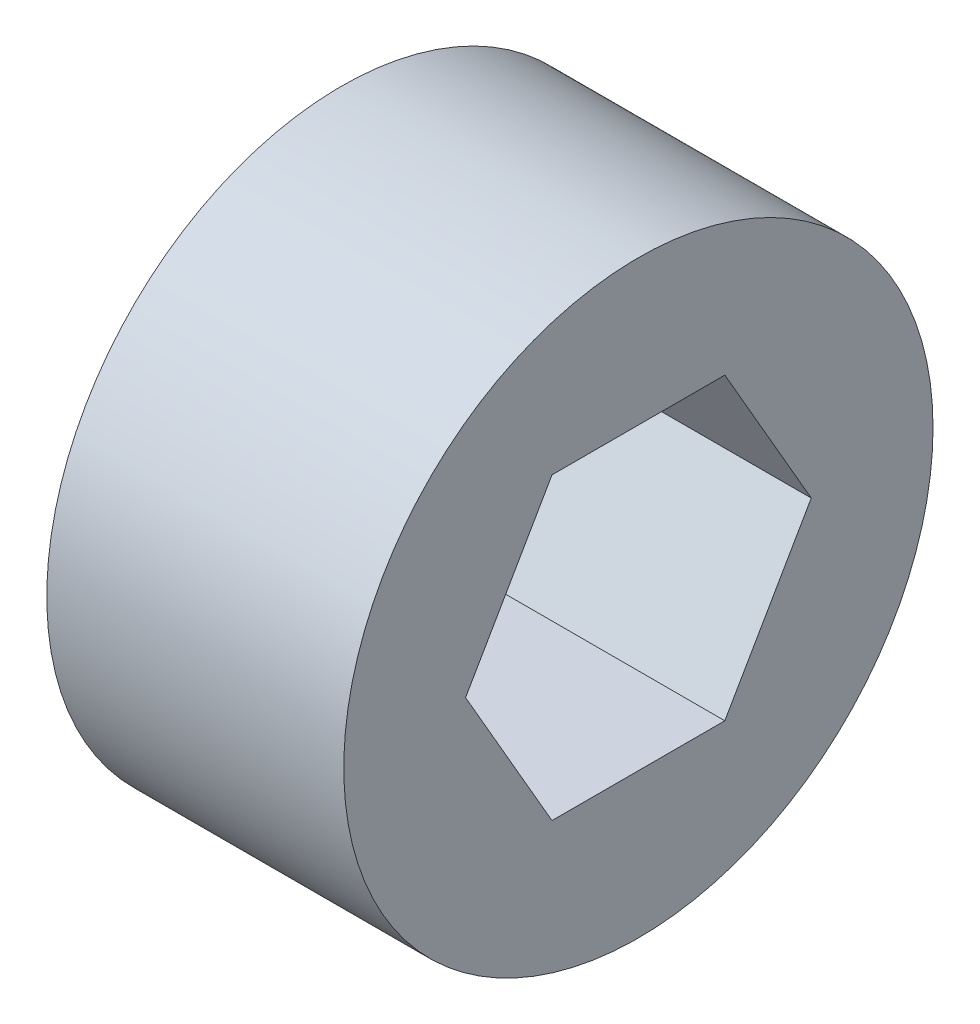
ISO-10303-21;
HEADER;
FILE_DESCRIPTION(('STEP AP214'),'2;1');
FILE_NAME('part.step','',(''),(''),'','','');
FILE_SCHEMA(('AUTOMOTIVE_DESIGN { 1 0 10303 214 1 1 1 1 }'));
ENDSEC;
DATA;
#1=APPLICATION_CONTEXT('core data for automotive mechanical design processes');
#2=APPLICATION_PROTOCOL_DEFINITION('international standard','automotive_design',2000,#1);
#3=PRODUCT_CONTEXT('',#1,'mechanical');
#4=PRODUCT('Part','Part','',(#3));
#5=PRODUCT_RELATED_PRODUCT_CATEGORY('part','',(#4));
#6=PRODUCT_DEFINITION_FORMATION('','',#4);
#7=PRODUCT_DEFINITION_CONTEXT('part definition',#1,'design');
#8=PRODUCT_DEFINITION('design','',#6,#7);
#9=PRODUCT_DEFINITION_SHAPE('','',#8);
#10=(LENGTH_UNIT() NAMED_UNIT(*) SI_UNIT(.MILLI.,.METRE.));
#11=(NAMED_UNIT(*) PLANE_ANGLE_UNIT() SI_UNIT($,.RADIAN.));
#12=(NAMED_UNIT(*) SI_UNIT($,.STERADIAN.) SOLID_ANGLE_UNIT());
#13=UNCERTAINTY_MEASURE_WITH_UNIT(LENGTH_MEASURE(1.E-05),#10,'distance_accuracy_value','');
#14=(GEOMETRIC_REPRESENTATION_CONTEXT(3) GLOBAL_UNCERTAINTY_ASSIGNED_CONTEXT((#13)) GLOBAL_UNIT_ASSIGNED_CONTEXT((#10,
#11,#12)) REPRESENTATION_CONTEXT('',''));
#15=CARTESIAN_POINT('',(0.,0.,0.));
#16=DIRECTION('',(0.,0.,1.));
#17=DIRECTION('',(1.,0.,0.));
#18=AXIS2_PLACEMENT_3D('',#15,#16,#17);
#19=CARTESIAN_POINT('',(12.6,0.,0.));
#20=DIRECTION('',(1.,0.,0.));
#21=DIRECTION('',(0.,0.,-1.));
#22=AXIS2_PLACEMENT_3D('',#19,#20,#21);
#23=PLANE('',#22);
#24=CARTESIAN_POINT('',(12.6,0.,0.));
#25=DIRECTION('',(1.,0.,0.));
#26=DIRECTION('',(0.,0.,-1.));
#27=AXIS2_PLACEMENT_3D('',#24,#25,#26);
#28=CIRCLE('',#27,12.5);
#29=CARTESIAN_POINT('',(12.6,0.,-12.5));
#30=VERTEX_POINT('',#29);
#31=EDGE_CURVE('E11',#30,#30,#28,.T.);
#32=ORIENTED_EDGE('',*,*,#31,.T.);
#33=EDGE_LOOP('',(#32));
#34=FACE_BOUND('',#33,.T.);
#35=DIRECTION('',(0.,0.866025403784438,0.500000000000001));
#36=VECTOR('',#35,1.);
#37=CARTESIAN_POINT('',(12.6,0.,-7.33234841870824));
#38=LINE('',#37,#36);
#39=CARTESIAN_POINT('',(12.6,0.,-7.33234841870824));
#40=VERTEX_POINT('',#39);
#41=CARTESIAN_POINT('',(12.6,6.35,-3.6661742093541));
#42=VERTEX_POINT('',#41);
#43=EDGE_CURVE('E102',#40,#42,#38,.T.);
#44=ORIENTED_EDGE('',*,*,#43,.F.);
#45=DIRECTION('',(0.,0.866025403784442,-0.499999999999995));
#46=VECTOR('',#45,1.);
#47=CARTESIAN_POINT('',(12.6,-6.34999999999995,-3.66617420935419));
#48=LINE('',#47,#46);
#49=CARTESIAN_POINT('',(12.6,-6.34999999999995,-3.66617420935419));
#50=VERTEX_POINT('',#49);
#51=EDGE_CURVE('E93',#50,#40,#48,.T.);
#52=ORIENTED_EDGE('',*,*,#51,.F.);
#53=DIRECTION('',(0.,0.,-1.));
#54=VECTOR('',#53,1.);
#55=CARTESIAN_POINT('',(12.6,-6.35000000000002,3.66617420935406));
#56=LINE('',#55,#54);
#57=CARTESIAN_POINT('',(12.6,-6.35000000000003,3.66617420935406));
#58=VERTEX_POINT('',#57);
#59=EDGE_CURVE('E127',#58,#50,#56,.T.);
#60=ORIENTED_EDGE('',*,*,#59,.F.);
#61=DIRECTION('',(0.,-0.866025403784435,-0.500000000000007));
#62=VECTOR('',#61,1.);
#63=CARTESIAN_POINT('',(12.6,0.,7.33234841870824));
#64=LINE('',#63,#62);
#65=CARTESIAN_POINT('',(12.6,0.,7.33234841870824));
#66=VERTEX_POINT('',#65);
#67=EDGE_CURVE('E124',#66,#58,#64,.T.);
#68=ORIENTED_EDGE('',*,*,#67,.F.);
#69=DIRECTION('',(0.,-0.866025403784442,0.499999999999995));
#70=VECTOR('',#69,1.);
#71=CARTESIAN_POINT('',(12.6,6.34999999999997,3.66617420935415));
#72=LINE('',#71,#70);
#73=CARTESIAN_POINT('',(12.6,6.34999999999997,3.66617420935415));
#74=VERTEX_POINT('',#73);
#75=EDGE_CURVE('E119',#74,#66,#72,.T.);
#76=ORIENTED_EDGE('',*,*,#75,.F.);
#77=DIRECTION('',(0.,0.,1.));
#78=VECTOR('',#77,1.);
#79=CARTESIAN_POINT('',(12.6,6.35,-3.6661742093541));
#80=LINE('',#79,#78);
#81=EDGE_CURVE('E115',#42,#74,#80,.T.);
#82=ORIENTED_EDGE('',*,*,#81,.F.);
#83=EDGE_LOOP('',(#44,#52,#60,#68,#76,#82));
#84=FACE_BOUND('',#83,.T.);
#85=ADVANCED_FACE('F39',(#34,#84),#23,.T.);
#86=CARTESIAN_POINT('',(0.,0.,0.));
#87=DIRECTION('',(1.,0.,0.));
#88=DIRECTION('',(0.,0.,-1.));
#89=AXIS2_PLACEMENT_3D('',#86,#87,#88);
#90=PLANE('',#89);
#91=CARTESIAN_POINT('',(0.,0.,0.));
#92=DIRECTION('',(1.,0.,0.));
#93=DIRECTION('',(0.,0.,-1.));
#94=AXIS2_PLACEMENT_3D('',#91,#92,#93);
#95=CIRCLE('',#94,12.5);
#96=CARTESIAN_POINT('',(0.,0.,-12.5));
#97=VERTEX_POINT('',#96);
#98=EDGE_CURVE('E43',#97,#97,#95,.T.);
#99=ORIENTED_EDGE('',*,*,#98,.F.);
#100=EDGE_LOOP('',(#99));
#101=FACE_BOUND('',#100,.T.);
#102=DIRECTION('',(0.,0.866025403784442,-0.499999999999995));
#103=VECTOR('',#102,1.);
#104=CARTESIAN_POINT('',(0.,-6.34999999999995,-3.66617420935419));
#105=LINE('',#104,#103);
#106=CARTESIAN_POINT('',(0.,-6.34999999999995,-3.66617420935419));
#107=VERTEX_POINT('',#106);
#108=CARTESIAN_POINT('',(0.,0.,-7.33234841870824));
#109=VERTEX_POINT('',#108);
#110=EDGE_CURVE('E63',#107,#109,#105,.T.);
#111=ORIENTED_EDGE('',*,*,#110,.T.);
#112=DIRECTION('',(0.,0.866025403784438,0.500000000000001));
#113=VECTOR('',#112,1.);
#114=CARTESIAN_POINT('',(0.,0.,-7.33234841870824));
#115=LINE('',#114,#113);
#116=CARTESIAN_POINT('',(0.,6.35,-3.6661742093541));
#117=VERTEX_POINT('',#116);
#118=EDGE_CURVE('E109',#109,#117,#115,.T.);
#119=ORIENTED_EDGE('',*,*,#118,.T.);
#120=DIRECTION('',(0.,0.,1.));
#121=VECTOR('',#120,1.);
#122=CARTESIAN_POINT('',(0.,6.35,-3.6661742093541));
#123=LINE('',#122,#121);
#124=CARTESIAN_POINT('',(0.,6.34999999999997,3.66617420935415));
#125=VERTEX_POINT('',#124);
#126=EDGE_CURVE('E134',#117,#125,#123,.T.);
#127=ORIENTED_EDGE('',*,*,#126,.T.);
#128=DIRECTION('',(0.,-0.866025403784442,0.499999999999995));
#129=VECTOR('',#128,1.);
#130=CARTESIAN_POINT('',(0.,6.34999999999997,3.66617420935415));
#131=LINE('',#130,#129);
#132=CARTESIAN_POINT('',(0.,0.,7.33234841870824));
#133=VERTEX_POINT('',#132);
#134=EDGE_CURVE('E138',#125,#133,#131,.T.);
#135=ORIENTED_EDGE('',*,*,#134,.T.);
#136=DIRECTION('',(0.,-0.866025403784435,-0.500000000000007));
#137=VECTOR('',#136,1.);
#138=CARTESIAN_POINT('',(0.,0.,7.33234841870824));
#139=LINE('',#138,#137);
#140=CARTESIAN_POINT('',(0.,-6.35000000000002,3.66617420935406));
#141=VERTEX_POINT('',#140);
#142=EDGE_CURVE('E142',#133,#141,#139,.T.);
#143=ORIENTED_EDGE('',*,*,#142,.T.);
#144=DIRECTION('',(0.,0.,-1.));
#145=VECTOR('',#144,1.);
#146=CARTESIAN_POINT('',(0.,-6.35000000000002,3.66617420935406));
#147=LINE('',#146,#145);
#148=EDGE_CURVE('E103',#141,#107,#147,.T.);
#149=ORIENTED_EDGE('',*,*,#148,.T.);
#150=EDGE_LOOP('',(#111,#119,#127,#135,#143,#149));
#151=FACE_BOUND('',#150,.T.);
#152=ADVANCED_FACE('F166',(#101,#151),#90,.F.);
#153=CARTESIAN_POINT('',(12.6,0.,0.));
#154=DIRECTION('',(-1.,0.,0.));
#155=DIRECTION('',(0.,0.,1.));
#156=AXIS2_PLACEMENT_3D('',#153,#154,#155);
#157=CYLINDRICAL_SURFACE('',#156,12.5);
#158=ORIENTED_EDGE('',*,*,#31,.F.);
#159=EDGE_LOOP('',(#158));
#160=FACE_BOUND('',#159,.T.);
#161=ORIENTED_EDGE('',*,*,#98,.T.);
#162=EDGE_LOOP('',(#161));
#163=FACE_BOUND('',#162,.T.);
#164=ADVANCED_FACE('F41',(#160,#163),#157,.T.);
#165=CARTESIAN_POINT('',(12.6,-6.34999999999995,-3.66617420935419));
#166=DIRECTION('',(0.,0.499999999999995,0.866025403784441));
#167=DIRECTION('',(0.,-0.866025403784442,0.499999999999995));
#168=AXIS2_PLACEMENT_3D('',#165,#166,#167);
#169=PLANE('',#168);
#170=ORIENTED_EDGE('',*,*,#110,.F.);
#171=DIRECTION('',(-1.,0.,0.));
#172=VECTOR('',#171,1.);
#173=CARTESIAN_POINT('',(12.6,-6.34999999999995,-3.66617420935419));
#174=LINE('',#173,#172);
#175=EDGE_CURVE('E97',#50,#107,#174,.T.);
#176=ORIENTED_EDGE('',*,*,#175,.F.);
#177=ORIENTED_EDGE('',*,*,#51,.T.);
#178=DIRECTION('',(-1.,0.,0.));
#179=VECTOR('',#178,1.);
#180=CARTESIAN_POINT('',(12.6,0.,-7.33234841870824));
#181=LINE('',#180,#179);
#182=EDGE_CURVE('E96',#40,#109,#181,.T.);
#183=ORIENTED_EDGE('',*,*,#182,.T.);
#184=EDGE_LOOP('',(#170,#176,#177,#183));
#185=FACE_BOUND('',#184,.T.);
#186=ADVANCED_FACE('F95',(#185),#169,.T.);
#187=CARTESIAN_POINT('',(12.6,0.,-7.33234841870824));
#188=DIRECTION('',(0.,-0.500000000000001,0.866025403784438));
#189=DIRECTION('',(0.,-0.866025403784438,-0.500000000000001));
#190=AXIS2_PLACEMENT_3D('',#187,#188,#189);
#191=PLANE('',#190);
#192=ORIENTED_EDGE('',*,*,#118,.F.);
#193=ORIENTED_EDGE('',*,*,#182,.F.);
#194=ORIENTED_EDGE('',*,*,#43,.T.);
#195=DIRECTION('',(-1.,0.,0.));
#196=VECTOR('',#195,1.);
#197=CARTESIAN_POINT('',(12.6,6.35,-3.6661742093541));
#198=LINE('',#197,#196);
#199=EDGE_CURVE('E111',#42,#117,#198,.T.);
#200=ORIENTED_EDGE('',*,*,#199,.T.);
#201=EDGE_LOOP('',(#192,#193,#194,#200));
#202=FACE_BOUND('',#201,.T.);
#203=ADVANCED_FACE('F106',(#202),#191,.T.);
#204=CARTESIAN_POINT('',(12.6,6.35,-3.6661742093541));
#205=DIRECTION('',(0.,-1.,0.));
#206=DIRECTION('',(0.,0.,-1.));
#207=AXIS2_PLACEMENT_3D('',#204,#205,#206);
#208=PLANE('',#207);
#209=ORIENTED_EDGE('',*,*,#126,.F.);
#210=ORIENTED_EDGE('',*,*,#199,.F.);
#211=ORIENTED_EDGE('',*,*,#81,.T.);
#212=DIRECTION('',(-1.,0.,0.));
#213=VECTOR('',#212,1.);
#214=CARTESIAN_POINT('',(12.6,6.34999999999997,3.66617420935415));
#215=LINE('',#214,#213);
#216=EDGE_CURVE('E156',#74,#125,#215,.T.);
#217=ORIENTED_EDGE('',*,*,#216,.T.);
#218=EDGE_LOOP('',(#209,#210,#211,#217));
#219=FACE_BOUND('',#218,.T.);
#220=ADVANCED_FACE('F162',(#219),#208,.T.);
#221=CARTESIAN_POINT('',(12.6,6.34999999999997,3.66617420935415));
#222=DIRECTION('',(0.,-0.499999999999995,-0.866025403784442));
#223=DIRECTION('',(0.,0.866025403784442,-0.499999999999995));
#224=AXIS2_PLACEMENT_3D('',#221,#222,#223);
#225=PLANE('',#224);
#226=ORIENTED_EDGE('',*,*,#134,.F.);
#227=ORIENTED_EDGE('',*,*,#216,.F.);
#228=ORIENTED_EDGE('',*,*,#75,.T.);
#229=DIRECTION('',(-1.,0.,0.));
#230=VECTOR('',#229,1.);
#231=CARTESIAN_POINT('',(12.6,0.,7.33234841870824));
#232=LINE('',#231,#230);
#233=EDGE_CURVE('E153',#66,#133,#232,.T.);
#234=ORIENTED_EDGE('',*,*,#233,.T.);
#235=EDGE_LOOP('',(#226,#227,#228,#234));
#236=FACE_BOUND('',#235,.T.);
#237=ADVANCED_FACE('F174',(#236),#225,.T.);
#238=CARTESIAN_POINT('',(12.6,0.,7.33234841870824));
#239=DIRECTION('',(0.,0.500000000000007,-0.866025403784435));
#240=DIRECTION('',(0.,0.866025403784435,0.500000000000007));
#241=AXIS2_PLACEMENT_3D('',#238,#239,#240);
#242=PLANE('',#241);
#243=ORIENTED_EDGE('',*,*,#142,.F.);
#244=ORIENTED_EDGE('',*,*,#233,.F.);
#245=ORIENTED_EDGE('',*,*,#67,.T.);
#246=DIRECTION('',(-1.,0.,0.));
#247=VECTOR('',#246,1.);
#248=CARTESIAN_POINT('',(12.6,-6.35000000000002,3.66617420935406));
#249=LINE('',#248,#247);
#250=EDGE_CURVE('E55',#58,#141,#249,.T.);
#251=ORIENTED_EDGE('',*,*,#250,.T.);
#252=EDGE_LOOP('',(#243,#244,#245,#251));
#253=FACE_BOUND('',#252,.T.);
#254=ADVANCED_FACE('F172',(#253),#242,.T.);
#255=CARTESIAN_POINT('',(12.6,-6.35000000000002,3.66617420935406));
#256=DIRECTION('',(0.,1.,0.));
#257=DIRECTION('',(0.,0.,1.));
#258=AXIS2_PLACEMENT_3D('',#255,#256,#257);
#259=PLANE('',#258);
#260=ORIENTED_EDGE('',*,*,#148,.F.);
#261=ORIENTED_EDGE('',*,*,#250,.F.);
#262=ORIENTED_EDGE('',*,*,#59,.T.);
#263=ORIENTED_EDGE('',*,*,#175,.T.);
#264=EDGE_LOOP('',(#260,#261,#262,#263));
#265=FACE_BOUND('',#264,.T.);
#266=ADVANCED_FACE('F168',(#265),#259,.T.);
#267=CLOSED_SHELL('',(#85,#152,#164,#186,#203,#220,#237,#254,#266));
#268=MANIFOLD_SOLID_BREP('B2',#267);
#269=ADVANCED_BREP_SHAPE_REPRESENTATION('',(#18,#268),#14);
#270=SHAPE_DEFINITION_REPRESENTATION(#9,#269);
ENDSEC;
END-ISO-10303-21;
